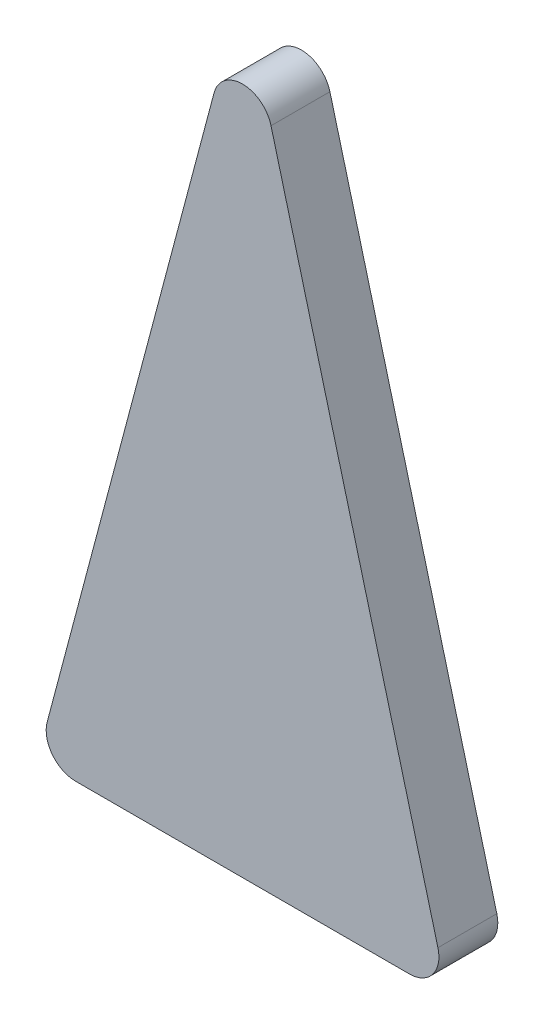
ISO-10303-21;
HEADER;
FILE_DESCRIPTION(('STEP AP214'),'2;1');
FILE_NAME('part.step','',(''),(''),'','','');
FILE_SCHEMA(('AUTOMOTIVE_DESIGN { 1 0 10303 214 1 1 1 1 }'));
ENDSEC;
DATA;
#1=APPLICATION_CONTEXT('core data for automotive mechanical design processes');
#2=APPLICATION_PROTOCOL_DEFINITION('international standard','automotive_design',2000,#1);
#3=PRODUCT_CONTEXT('',#1,'mechanical');
#4=PRODUCT('Part','Part','',(#3));
#5=PRODUCT_RELATED_PRODUCT_CATEGORY('part','',(#4));
#6=PRODUCT_DEFINITION_FORMATION('','',#4);
#7=PRODUCT_DEFINITION_CONTEXT('part definition',#1,'design');
#8=PRODUCT_DEFINITION('design','',#6,#7);
#9=PRODUCT_DEFINITION_SHAPE('','',#8);
#10=(LENGTH_UNIT() NAMED_UNIT(*) SI_UNIT(.MILLI.,.METRE.));
#11=(NAMED_UNIT(*) PLANE_ANGLE_UNIT() SI_UNIT($,.RADIAN.));
#12=(NAMED_UNIT(*) SI_UNIT($,.STERADIAN.) SOLID_ANGLE_UNIT());
#13=UNCERTAINTY_MEASURE_WITH_UNIT(LENGTH_MEASURE(1.E-05),#10,'distance_accuracy_value','');
#14=(GEOMETRIC_REPRESENTATION_CONTEXT(3) GLOBAL_UNCERTAINTY_ASSIGNED_CONTEXT((#13)) GLOBAL_UNIT_ASSIGNED_CONTEXT((#10,
#11,#12)) REPRESENTATION_CONTEXT('',''));
#15=CARTESIAN_POINT('',(0.,0.,0.));
#16=DIRECTION('',(0.,0.,1.));
#17=DIRECTION('',(1.,0.,0.));
#18=AXIS2_PLACEMENT_3D('',#15,#16,#17);
#19=CARTESIAN_POINT('',(-17.,3.,6.));
#20=DIRECTION('',(0.,0.,-1.));
#21=DIRECTION('',(-1.,0.,0.));
#22=AXIS2_PLACEMENT_3D('',#19,#20,#21);
#23=CYLINDRICAL_SURFACE('',#22,3.);
#24=CARTESIAN_POINT('',(-17.,3.,0.));
#25=DIRECTION('',(0.,0.,1.));
#26=DIRECTION('',(1.,0.,0.));
#27=AXIS2_PLACEMENT_3D('',#24,#25,#26);
#28=CIRCLE('',#27,3.);
#29=CARTESIAN_POINT('',(-19.8994553807795,3.77016783551955,0.));
#30=VERTEX_POINT('',#29);
#31=CARTESIAN_POINT('',(-17.,0.,0.));
#32=VERTEX_POINT('',#31);
#33=EDGE_CURVE('E118',#30,#32,#28,.T.);
#34=ORIENTED_EDGE('',*,*,#33,.T.);
#35=DIRECTION('',(0.,0.,-1.));
#36=VECTOR('',#35,1.);
#37=CARTESIAN_POINT('',(-17.,0.,6.));
#38=LINE('',#37,#36);
#39=CARTESIAN_POINT('',(-17.,0.,6.));
#40=VERTEX_POINT('',#39);
#41=EDGE_CURVE('E11',#40,#32,#38,.T.);
#42=ORIENTED_EDGE('',*,*,#41,.F.);
#43=CARTESIAN_POINT('',(-17.,3.,6.));
#44=DIRECTION('',(0.,0.,1.));
#45=DIRECTION('',(1.,0.,0.));
#46=AXIS2_PLACEMENT_3D('',#43,#44,#45);
#47=CIRCLE('',#46,3.);
#48=CARTESIAN_POINT('',(-19.8994553807795,3.77016783551955,6.));
#49=VERTEX_POINT('',#48);
#50=EDGE_CURVE('E128',#49,#40,#47,.T.);
#51=ORIENTED_EDGE('',*,*,#50,.F.);
#52=DIRECTION('',(0.,0.,-1.));
#53=VECTOR('',#52,1.);
#54=CARTESIAN_POINT('',(-19.8994553807795,3.77016783551955,6.));
#55=LINE('',#54,#53);
#56=EDGE_CURVE('E114',#49,#30,#55,.T.);
#57=ORIENTED_EDGE('',*,*,#56,.T.);
#58=EDGE_LOOP('',(#34,#42,#51,#57));
#59=FACE_BOUND('',#58,.T.);
#60=ADVANCED_FACE('F34',(#59),#23,.T.);
#61=CARTESIAN_POINT('',(-17.,0.,6.));
#62=DIRECTION('',(0.,1.,0.));
#63=DIRECTION('',(0.,0.,1.));
#64=AXIS2_PLACEMENT_3D('',#61,#62,#63);
#65=PLANE('',#64);
#66=DIRECTION('',(1.,0.,0.));
#67=VECTOR('',#66,1.);
#68=CARTESIAN_POINT('',(-17.,0.,0.));
#69=LINE('',#68,#67);
#70=CARTESIAN_POINT('',(17.,0.,0.));
#71=VERTEX_POINT('',#70);
#72=EDGE_CURVE('E121',#32,#71,#69,.T.);
#73=ORIENTED_EDGE('',*,*,#72,.T.);
#74=DIRECTION('',(0.,0.,-1.));
#75=VECTOR('',#74,1.);
#76=CARTESIAN_POINT('',(17.,0.,6.));
#77=LINE('',#76,#75);
#78=CARTESIAN_POINT('',(17.,0.,6.));
#79=VERTEX_POINT('',#78);
#80=EDGE_CURVE('E42',#79,#71,#77,.T.);
#81=ORIENTED_EDGE('',*,*,#80,.F.);
#82=DIRECTION('',(1.,0.,0.));
#83=VECTOR('',#82,1.);
#84=CARTESIAN_POINT('',(-17.,0.,6.));
#85=LINE('',#84,#83);
#86=EDGE_CURVE('E87',#40,#79,#85,.T.);
#87=ORIENTED_EDGE('',*,*,#86,.F.);
#88=ORIENTED_EDGE('',*,*,#41,.T.);
#89=EDGE_LOOP('',(#73,#81,#87,#88));
#90=FACE_BOUND('',#89,.T.);
#91=ADVANCED_FACE('F152',(#90),#65,.F.);
#92=CARTESIAN_POINT('',(17.,3.,6.));
#93=DIRECTION('',(0.,0.,-1.));
#94=DIRECTION('',(-1.,0.,0.));
#95=AXIS2_PLACEMENT_3D('',#92,#93,#94);
#96=CYLINDRICAL_SURFACE('',#95,3.);
#97=CARTESIAN_POINT('',(17.,3.,0.));
#98=DIRECTION('',(0.,0.,1.));
#99=DIRECTION('',(1.,0.,0.));
#100=AXIS2_PLACEMENT_3D('',#97,#98,#99);
#101=CIRCLE('',#100,3.);
#102=CARTESIAN_POINT('',(19.8994553807795,3.77016783551955,0.));
#103=VERTEX_POINT('',#102);
#104=EDGE_CURVE('E123',#71,#103,#101,.T.);
#105=ORIENTED_EDGE('',*,*,#104,.T.);
#106=DIRECTION('',(0.,0.,-1.));
#107=VECTOR('',#106,1.);
#108=CARTESIAN_POINT('',(19.8994553807795,3.77016783551955,6.));
#109=LINE('',#108,#107);
#110=CARTESIAN_POINT('',(19.8994553807795,3.77016783551955,6.));
#111=VERTEX_POINT('',#110);
#112=EDGE_CURVE('E109',#111,#103,#109,.T.);
#113=ORIENTED_EDGE('',*,*,#112,.F.);
#114=CARTESIAN_POINT('',(17.,3.,6.));
#115=DIRECTION('',(0.,0.,1.));
#116=DIRECTION('',(1.,0.,0.));
#117=AXIS2_PLACEMENT_3D('',#114,#115,#116);
#118=CIRCLE('',#117,3.);
#119=EDGE_CURVE('E100',#79,#111,#118,.T.);
#120=ORIENTED_EDGE('',*,*,#119,.F.);
#121=ORIENTED_EDGE('',*,*,#80,.T.);
#122=EDGE_LOOP('',(#105,#113,#120,#121));
#123=FACE_BOUND('',#122,.T.);
#124=ADVANCED_FACE('F134',(#123),#96,.T.);
#125=CARTESIAN_POINT('',(19.8994553807795,3.77016783551955,6.));
#126=DIRECTION('',(-0.966485126926496,-0.256722611839851,0.));
#127=DIRECTION('',(0.256722611839851,-0.966485126926496,0.));
#128=AXIS2_PLACEMENT_3D('',#125,#126,#127);
#129=PLANE('',#128);
#130=DIRECTION('',(-0.256722611839851,0.966485126926496,0.));
#131=VECTOR('',#130,1.);
#132=CARTESIAN_POINT('',(19.8994553807795,3.77016783551955,0.));
#133=LINE('',#132,#131);
#134=CARTESIAN_POINT('',(2.89945538077948,67.7701678355195,0.));
#135=VERTEX_POINT('',#134);
#136=EDGE_CURVE('E108',#103,#135,#133,.T.);
#137=ORIENTED_EDGE('',*,*,#136,.T.);
#138=DIRECTION('',(0.,0.,-1.));
#139=VECTOR('',#138,1.);
#140=CARTESIAN_POINT('',(2.89945538077948,67.7701678355195,6.));
#141=LINE('',#140,#139);
#142=CARTESIAN_POINT('',(2.89945538077948,67.7701678355195,6.));
#143=VERTEX_POINT('',#142);
#144=EDGE_CURVE('E105',#143,#135,#141,.T.);
#145=ORIENTED_EDGE('',*,*,#144,.F.);
#146=DIRECTION('',(-0.256722611839851,0.966485126926496,0.));
#147=VECTOR('',#146,1.);
#148=CARTESIAN_POINT('',(19.8994553807795,3.77016783551955,6.));
#149=LINE('',#148,#147);
#150=EDGE_CURVE('E94',#111,#143,#149,.T.);
#151=ORIENTED_EDGE('',*,*,#150,.F.);
#152=ORIENTED_EDGE('',*,*,#112,.T.);
#153=EDGE_LOOP('',(#137,#145,#151,#152));
#154=FACE_BOUND('',#153,.T.);
#155=ADVANCED_FACE('F106',(#154),#129,.F.);
#156=CARTESIAN_POINT('',(0.,67.,6.));
#157=DIRECTION('',(0.,0.,-1.));
#158=DIRECTION('',(-1.,0.,0.));
#159=AXIS2_PLACEMENT_3D('',#156,#157,#158);
#160=CYLINDRICAL_SURFACE('',#159,2.99999999999999);
#161=CARTESIAN_POINT('',(0.,67.,0.));
#162=DIRECTION('',(0.,0.,1.));
#163=DIRECTION('',(1.,0.,0.));
#164=AXIS2_PLACEMENT_3D('',#161,#162,#163);
#165=CIRCLE('',#164,2.99999999999999);
#166=CARTESIAN_POINT('',(-2.89945538077948,67.7701678355195,0.));
#167=VERTEX_POINT('',#166);
#168=EDGE_CURVE('E73',#135,#167,#165,.T.);
#169=ORIENTED_EDGE('',*,*,#168,.T.);
#170=DIRECTION('',(0.,0.,-1.));
#171=VECTOR('',#170,1.);
#172=CARTESIAN_POINT('',(-2.89945538077948,67.7701678355195,6.));
#173=LINE('',#172,#171);
#174=CARTESIAN_POINT('',(-2.89945538077948,67.7701678355195,6.));
#175=VERTEX_POINT('',#174);
#176=EDGE_CURVE('E110',#175,#167,#173,.T.);
#177=ORIENTED_EDGE('',*,*,#176,.F.);
#178=CARTESIAN_POINT('',(0.,67.,6.));
#179=DIRECTION('',(0.,0.,1.));
#180=DIRECTION('',(1.,0.,0.));
#181=AXIS2_PLACEMENT_3D('',#178,#179,#180);
#182=CIRCLE('',#181,2.99999999999999);
#183=EDGE_CURVE('E98',#143,#175,#182,.T.);
#184=ORIENTED_EDGE('',*,*,#183,.F.);
#185=ORIENTED_EDGE('',*,*,#144,.T.);
#186=EDGE_LOOP('',(#169,#177,#184,#185));
#187=FACE_BOUND('',#186,.T.);
#188=ADVANCED_FACE('F112',(#187),#160,.T.);
#189=CARTESIAN_POINT('',(-19.8994553807795,3.77016783551955,6.));
#190=DIRECTION('',(0.966485126926496,-0.256722611839851,0.));
#191=DIRECTION('',(0.256722611839851,0.966485126926496,0.));
#192=AXIS2_PLACEMENT_3D('',#189,#190,#191);
#193=PLANE('',#192);
#194=DIRECTION('',(-0.256722611839851,-0.966485126926496,0.));
#195=VECTOR('',#194,1.);
#196=CARTESIAN_POINT('',(-19.8994553807795,3.77016783551955,0.));
#197=LINE('',#196,#195);
#198=EDGE_CURVE('E79',#167,#30,#197,.T.);
#199=ORIENTED_EDGE('',*,*,#198,.T.);
#200=ORIENTED_EDGE('',*,*,#56,.F.);
#201=DIRECTION('',(-0.256722611839851,-0.966485126926496,0.));
#202=VECTOR('',#201,1.);
#203=CARTESIAN_POINT('',(-19.8994553807795,3.77016783551955,6.));
#204=LINE('',#203,#202);
#205=EDGE_CURVE('E50',#175,#49,#204,.T.);
#206=ORIENTED_EDGE('',*,*,#205,.F.);
#207=ORIENTED_EDGE('',*,*,#176,.T.);
#208=EDGE_LOOP('',(#199,#200,#206,#207));
#209=FACE_BOUND('',#208,.T.);
#210=ADVANCED_FACE('F141',(#209),#193,.F.);
#211=CARTESIAN_POINT('',(-17.,3.,6.));
#212=DIRECTION('',(0.,0.,1.));
#213=DIRECTION('',(1.,0.,0.));
#214=AXIS2_PLACEMENT_3D('',#211,#212,#213);
#215=PLANE('',#214);
#216=ORIENTED_EDGE('',*,*,#50,.T.);
#217=ORIENTED_EDGE('',*,*,#86,.T.);
#218=ORIENTED_EDGE('',*,*,#119,.T.);
#219=ORIENTED_EDGE('',*,*,#150,.T.);
#220=ORIENTED_EDGE('',*,*,#183,.T.);
#221=ORIENTED_EDGE('',*,*,#205,.T.);
#222=EDGE_LOOP('',(#216,#217,#218,#219,#220,#221));
#223=FACE_BOUND('',#222,.T.);
#224=ADVANCED_FACE('F96',(#223),#215,.T.);
#225=CARTESIAN_POINT('',(-17.,3.,0.));
#226=DIRECTION('',(0.,0.,1.));
#227=DIRECTION('',(1.,0.,0.));
#228=AXIS2_PLACEMENT_3D('',#225,#226,#227);
#229=PLANE('',#228);
#230=ORIENTED_EDGE('',*,*,#33,.F.);
#231=ORIENTED_EDGE('',*,*,#198,.F.);
#232=ORIENTED_EDGE('',*,*,#168,.F.);
#233=ORIENTED_EDGE('',*,*,#136,.F.);
#234=ORIENTED_EDGE('',*,*,#104,.F.);
#235=ORIENTED_EDGE('',*,*,#72,.F.);
#236=EDGE_LOOP('',(#230,#231,#232,#233,#234,#235));
#237=FACE_BOUND('',#236,.T.);
#238=ADVANCED_FACE('F137',(#237),#229,.F.);
#239=CLOSED_SHELL('',(#60,#91,#124,#155,#188,#210,#224,#238));
#240=MANIFOLD_SOLID_BREP('B2',#239);
#241=ADVANCED_BREP_SHAPE_REPRESENTATION('',(#18,#240),#14);
#242=SHAPE_DEFINITION_REPRESENTATION(#9,#241);
ENDSEC;
END-ISO-10303-21;
